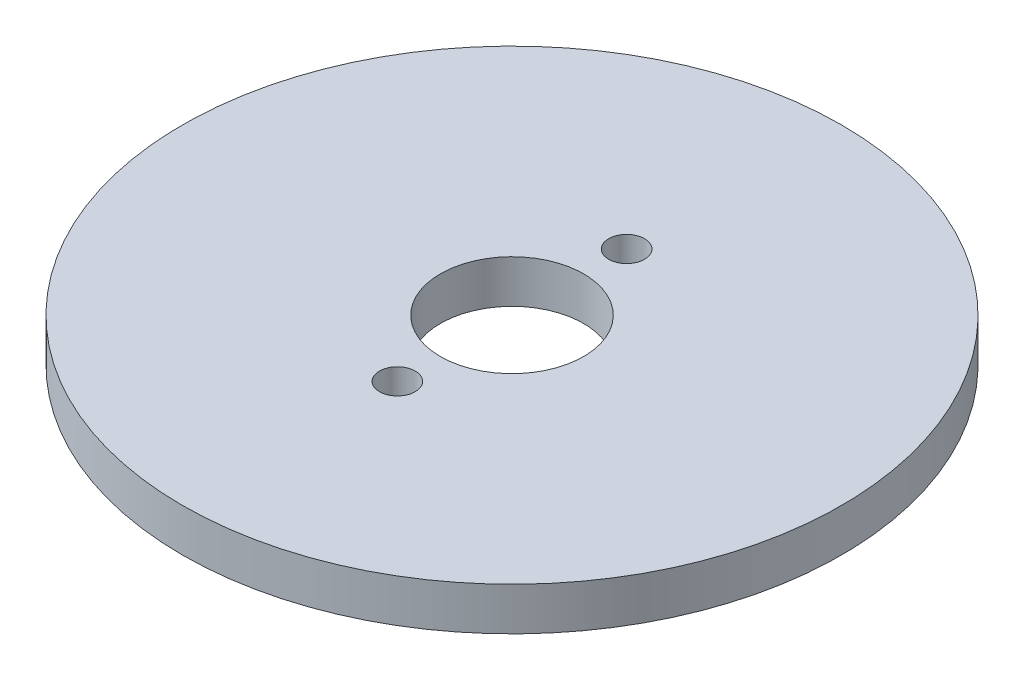
ISO-10303-21;
HEADER;
FILE_DESCRIPTION(('STEP AP214'),'2;1');
FILE_NAME('part.step','',(''),(''),'','','');
FILE_SCHEMA(('AUTOMOTIVE_DESIGN { 1 0 10303 214 1 1 1 1 }'));
ENDSEC;
DATA;
#1=APPLICATION_CONTEXT('core data for automotive mechanical design processes');
#2=APPLICATION_PROTOCOL_DEFINITION('international standard','automotive_design',2000,#1);
#3=PRODUCT_CONTEXT('',#1,'mechanical');
#4=PRODUCT('Part','Part','',(#3));
#5=PRODUCT_RELATED_PRODUCT_CATEGORY('part','',(#4));
#6=PRODUCT_DEFINITION_FORMATION('','',#4);
#7=PRODUCT_DEFINITION_CONTEXT('part definition',#1,'design');
#8=PRODUCT_DEFINITION('design','',#6,#7);
#9=PRODUCT_DEFINITION_SHAPE('','',#8);
#10=(LENGTH_UNIT() NAMED_UNIT(*) SI_UNIT(.MILLI.,.METRE.));
#11=(NAMED_UNIT(*) PLANE_ANGLE_UNIT() SI_UNIT($,.RADIAN.));
#12=(NAMED_UNIT(*) SI_UNIT($,.STERADIAN.) SOLID_ANGLE_UNIT());
#13=UNCERTAINTY_MEASURE_WITH_UNIT(LENGTH_MEASURE(1.E-05),#10,'distance_accuracy_value','');
#14=(GEOMETRIC_REPRESENTATION_CONTEXT(3) GLOBAL_UNCERTAINTY_ASSIGNED_CONTEXT((#13)) GLOBAL_UNIT_ASSIGNED_CONTEXT((#10,
#11,#12)) REPRESENTATION_CONTEXT('',''));
#15=CARTESIAN_POINT('',(0.,0.,0.));
#16=DIRECTION('',(0.,0.,1.));
#17=DIRECTION('',(1.,0.,0.));
#18=AXIS2_PLACEMENT_3D('',#15,#16,#17);
#19=CARTESIAN_POINT('',(0.,3.,0.));
#20=DIRECTION('',(0.,-1.,0.));
#21=DIRECTION('',(0.,0.,-1.));
#22=AXIS2_PLACEMENT_3D('',#19,#20,#21);
#23=CYLINDRICAL_SURFACE('',#22,23.);
#24=CARTESIAN_POINT('',(0.,3.,0.));
#25=DIRECTION('',(0.,1.,0.));
#26=DIRECTION('',(0.,0.,1.));
#27=AXIS2_PLACEMENT_3D('',#24,#25,#26);
#28=CIRCLE('',#27,23.);
#29=CARTESIAN_POINT('',(0.,3.,23.));
#30=VERTEX_POINT('',#29);
#31=EDGE_CURVE('E10',#30,#30,#28,.T.);
#32=ORIENTED_EDGE('',*,*,#31,.F.);
#33=EDGE_LOOP('',(#32));
#34=FACE_BOUND('',#33,.T.);
#35=CARTESIAN_POINT('',(0.,0.,0.));
#36=DIRECTION('',(0.,1.,0.));
#37=DIRECTION('',(0.,0.,1.));
#38=AXIS2_PLACEMENT_3D('',#35,#36,#37);
#39=CIRCLE('',#38,23.);
#40=CARTESIAN_POINT('',(0.,0.,23.));
#41=VERTEX_POINT('',#40);
#42=EDGE_CURVE('E37',#41,#41,#39,.T.);
#43=ORIENTED_EDGE('',*,*,#42,.T.);
#44=EDGE_LOOP('',(#43));
#45=FACE_BOUND('',#44,.T.);
#46=ADVANCED_FACE('F34',(#34,#45),#23,.T.);
#47=CARTESIAN_POINT('',(0.,3.,0.));
#48=DIRECTION('',(0.,1.,0.));
#49=DIRECTION('',(0.,0.,1.));
#50=AXIS2_PLACEMENT_3D('',#47,#48,#49);
#51=PLANE('',#50);
#52=CARTESIAN_POINT('',(0.,3.,8.));
#53=DIRECTION('',(0.,1.,0.));
#54=DIRECTION('',(0.,0.,1.));
#55=AXIS2_PLACEMENT_3D('',#52,#53,#54);
#56=CIRCLE('',#55,1.25);
#57=CARTESIAN_POINT('',(0.,3.,9.25));
#58=VERTEX_POINT('',#57);
#59=EDGE_CURVE('E58',#58,#58,#56,.T.);
#60=ORIENTED_EDGE('',*,*,#59,.F.);
#61=EDGE_LOOP('',(#60));
#62=FACE_BOUND('',#61,.T.);
#63=CARTESIAN_POINT('',(0.,3.,-8.));
#64=DIRECTION('',(0.,1.,0.));
#65=DIRECTION('',(0.,0.,1.));
#66=AXIS2_PLACEMENT_3D('',#63,#64,#65);
#67=CIRCLE('',#66,1.25);
#68=CARTESIAN_POINT('',(0.,3.,-6.75));
#69=VERTEX_POINT('',#68);
#70=EDGE_CURVE('E55',#69,#69,#67,.T.);
#71=ORIENTED_EDGE('',*,*,#70,.F.);
#72=EDGE_LOOP('',(#71));
#73=FACE_BOUND('',#72,.T.);
#74=CARTESIAN_POINT('',(0.,3.,0.));
#75=DIRECTION('',(0.,1.,0.));
#76=DIRECTION('',(0.,0.,1.));
#77=AXIS2_PLACEMENT_3D('',#74,#75,#76);
#78=CIRCLE('',#77,5.);
#79=CARTESIAN_POINT('',(0.,3.,5.));
#80=VERTEX_POINT('',#79);
#81=EDGE_CURVE('E46',#80,#80,#78,.T.);
#82=ORIENTED_EDGE('',*,*,#81,.F.);
#83=EDGE_LOOP('',(#82));
#84=FACE_BOUND('',#83,.T.);
#85=ORIENTED_EDGE('',*,*,#31,.T.);
#86=EDGE_LOOP('',(#85));
#87=FACE_BOUND('',#86,.T.);
#88=ADVANCED_FACE('F74',(#62,#73,#84,#87),#51,.T.);
#89=CARTESIAN_POINT('',(0.,0.,0.));
#90=DIRECTION('',(0.,1.,0.));
#91=DIRECTION('',(0.,0.,1.));
#92=AXIS2_PLACEMENT_3D('',#89,#90,#91);
#93=PLANE('',#92);
#94=CARTESIAN_POINT('',(0.,0.,8.));
#95=DIRECTION('',(0.,1.,0.));
#96=DIRECTION('',(0.,0.,1.));
#97=AXIS2_PLACEMENT_3D('',#94,#95,#96);
#98=CIRCLE('',#97,1.25);
#99=CARTESIAN_POINT('',(0.,0.,9.25));
#100=VERTEX_POINT('',#99);
#101=EDGE_CURVE('E49',#100,#100,#98,.T.);
#102=ORIENTED_EDGE('',*,*,#101,.T.);
#103=EDGE_LOOP('',(#102));
#104=FACE_BOUND('',#103,.T.);
#105=CARTESIAN_POINT('',(0.,0.,-8.));
#106=DIRECTION('',(0.,1.,0.));
#107=DIRECTION('',(0.,0.,1.));
#108=AXIS2_PLACEMENT_3D('',#105,#106,#107);
#109=CIRCLE('',#108,1.25);
#110=CARTESIAN_POINT('',(0.,0.,-6.75));
#111=VERTEX_POINT('',#110);
#112=EDGE_CURVE('E52',#111,#111,#109,.T.);
#113=ORIENTED_EDGE('',*,*,#112,.T.);
#114=EDGE_LOOP('',(#113));
#115=FACE_BOUND('',#114,.T.);
#116=CARTESIAN_POINT('',(0.,0.,0.));
#117=DIRECTION('',(0.,1.,0.));
#118=DIRECTION('',(0.,0.,1.));
#119=AXIS2_PLACEMENT_3D('',#116,#117,#118);
#120=CIRCLE('',#119,5.);
#121=CARTESIAN_POINT('',(0.,0.,5.));
#122=VERTEX_POINT('',#121);
#123=EDGE_CURVE('E44',#122,#122,#120,.T.);
#124=ORIENTED_EDGE('',*,*,#123,.T.);
#125=EDGE_LOOP('',(#124));
#126=FACE_BOUND('',#125,.T.);
#127=ORIENTED_EDGE('',*,*,#42,.F.);
#128=EDGE_LOOP('',(#127));
#129=FACE_BOUND('',#128,.T.);
#130=ADVANCED_FACE('F64',(#104,#115,#126,#129),#93,.F.);
#131=CARTESIAN_POINT('',(0.,0.,0.));
#132=DIRECTION('',(0.,1.,0.));
#133=DIRECTION('',(0.,0.,1.));
#134=AXIS2_PLACEMENT_3D('',#131,#132,#133);
#135=CYLINDRICAL_SURFACE('',#134,5.);
#136=ORIENTED_EDGE('',*,*,#123,.F.);
#137=EDGE_LOOP('',(#136));
#138=FACE_BOUND('',#137,.T.);
#139=ORIENTED_EDGE('',*,*,#81,.T.);
#140=EDGE_LOOP('',(#139));
#141=FACE_BOUND('',#140,.T.);
#142=ADVANCED_FACE('F82',(#138,#141),#135,.F.);
#143=CARTESIAN_POINT('',(0.,0.,-8.));
#144=DIRECTION('',(0.,1.,0.));
#145=DIRECTION('',(0.,0.,1.));
#146=AXIS2_PLACEMENT_3D('',#143,#144,#145);
#147=CYLINDRICAL_SURFACE('',#146,1.25);
#148=ORIENTED_EDGE('',*,*,#112,.F.);
#149=EDGE_LOOP('',(#148));
#150=FACE_BOUND('',#149,.T.);
#151=ORIENTED_EDGE('',*,*,#70,.T.);
#152=EDGE_LOOP('',(#151));
#153=FACE_BOUND('',#152,.T.);
#154=ADVANCED_FACE('F70',(#150,#153),#147,.F.);
#155=CARTESIAN_POINT('',(0.,0.,8.));
#156=DIRECTION('',(0.,1.,0.));
#157=DIRECTION('',(0.,0.,1.));
#158=AXIS2_PLACEMENT_3D('',#155,#156,#157);
#159=CYLINDRICAL_SURFACE('',#158,1.25);
#160=ORIENTED_EDGE('',*,*,#101,.F.);
#161=EDGE_LOOP('',(#160));
#162=FACE_BOUND('',#161,.T.);
#163=ORIENTED_EDGE('',*,*,#59,.T.);
#164=EDGE_LOOP('',(#163));
#165=FACE_BOUND('',#164,.T.);
#166=ADVANCED_FACE('F67',(#162,#165),#159,.F.);
#167=CLOSED_SHELL('',(#46,#88,#130,#142,#154,#166));
#168=MANIFOLD_SOLID_BREP('B2',#167);
#169=ADVANCED_BREP_SHAPE_REPRESENTATION('',(#18,#168),#14);
#170=SHAPE_DEFINITION_REPRESENTATION(#9,#169);
ENDSEC;
END-ISO-10303-21;
